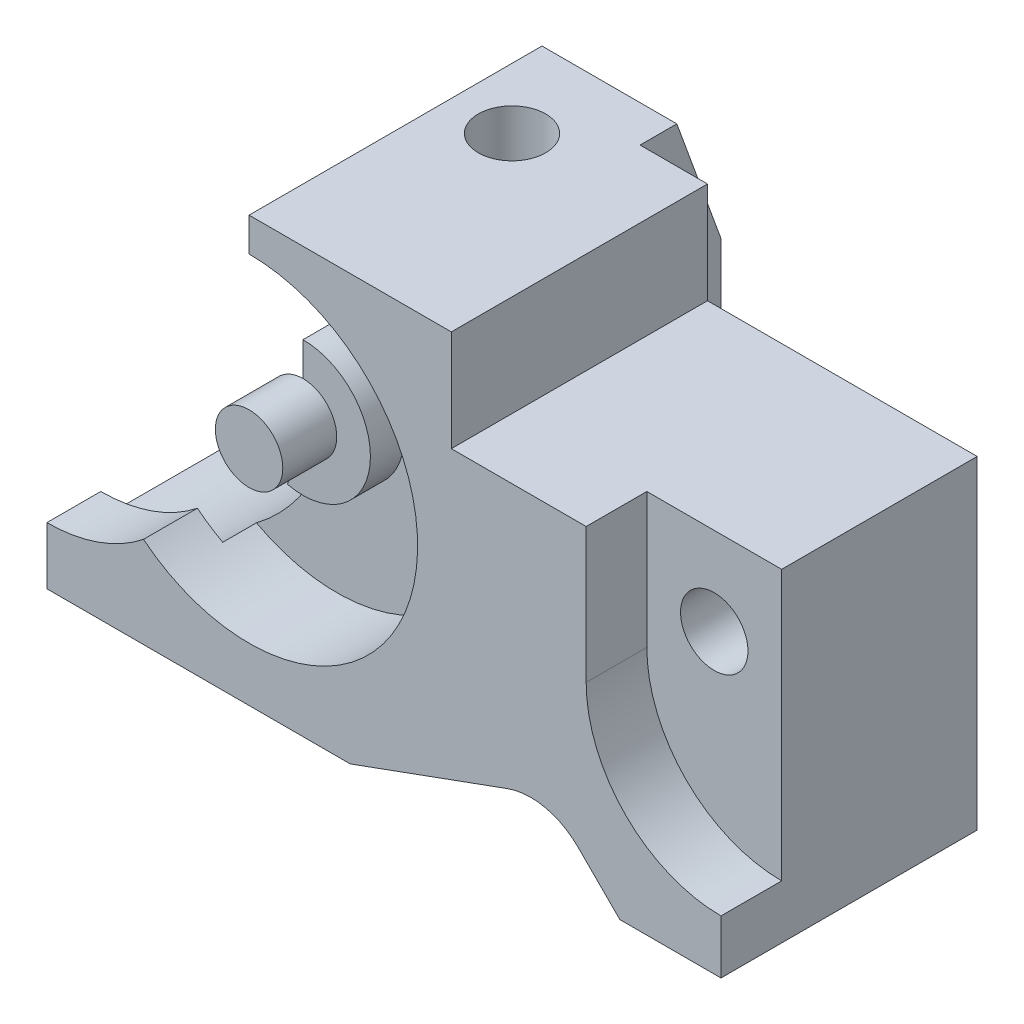
ISO-10303-21;
HEADER;
FILE_DESCRIPTION(('STEP AP214'),'2;1');
FILE_NAME('part.step','',(''),(''),'','','');
FILE_SCHEMA(('AUTOMOTIVE_DESIGN { 1 0 10303 214 1 1 1 1 }'));
ENDSEC;
DATA;
#1=APPLICATION_CONTEXT('core data for automotive mechanical design processes');
#2=APPLICATION_PROTOCOL_DEFINITION('international standard','automotive_design',2000,#1);
#3=PRODUCT_CONTEXT('',#1,'mechanical');
#4=PRODUCT('Part','Part','',(#3));
#5=PRODUCT_RELATED_PRODUCT_CATEGORY('part','',(#4));
#6=PRODUCT_DEFINITION_FORMATION('','',#4);
#7=PRODUCT_DEFINITION_CONTEXT('part definition',#1,'design');
#8=PRODUCT_DEFINITION('design','',#6,#7);
#9=PRODUCT_DEFINITION_SHAPE('','',#8);
#10=(LENGTH_UNIT() NAMED_UNIT(*) SI_UNIT(.MILLI.,.METRE.));
#11=(NAMED_UNIT(*) PLANE_ANGLE_UNIT() SI_UNIT($,.RADIAN.));
#12=(NAMED_UNIT(*) SI_UNIT($,.STERADIAN.) SOLID_ANGLE_UNIT());
#13=UNCERTAINTY_MEASURE_WITH_UNIT(LENGTH_MEASURE(1.E-05),#10,'distance_accuracy_value','');
#14=(GEOMETRIC_REPRESENTATION_CONTEXT(3) GLOBAL_UNCERTAINTY_ASSIGNED_CONTEXT((#13)) GLOBAL_UNIT_ASSIGNED_CONTEXT((#10,
#11,#12)) REPRESENTATION_CONTEXT('',''));
#15=CARTESIAN_POINT('',(0.,0.,0.));
#16=DIRECTION('',(0.,0.,1.));
#17=DIRECTION('',(1.,0.,0.));
#18=AXIS2_PLACEMENT_3D('',#15,#16,#17);
#19=CARTESIAN_POINT('',(0.,31.5,50.));
#20=DIRECTION('',(0.,-1.,0.));
#21=DIRECTION('',(1.,0.,0.));
#22=AXIS2_PLACEMENT_3D('',#19,#20,#21);
#23=PLANE('',#22);
#24=CARTESIAN_POINT('',(-11.,31.5,20.));
#25=DIRECTION('',(0.,1.,0.));
#26=DIRECTION('',(-1.,0.,0.));
#27=AXIS2_PLACEMENT_3D('',#24,#25,#26);
#28=CIRCLE('',#27,5.);
#29=CARTESIAN_POINT('',(-16.,31.5,20.));
#30=VERTEX_POINT('',#29);
#31=EDGE_CURVE('E848',#30,#30,#28,.T.);
#32=ORIENTED_EDGE('',*,*,#31,.F.);
#33=EDGE_LOOP('',(#32));
#34=FACE_BOUND('',#33,.T.);
#35=DIRECTION('',(0.,0.,-1.));
#36=VECTOR('',#35,1.);
#37=CARTESIAN_POINT('',(0.,31.5,12.));
#38=LINE('',#37,#36);
#39=CARTESIAN_POINT('',(0.,31.5,12.));
#40=VERTEX_POINT('',#39);
#41=CARTESIAN_POINT('',(0.,31.5,6.55146421679151));
#42=VERTEX_POINT('',#41);
#43=EDGE_CURVE('E218',#40,#42,#38,.T.);
#44=ORIENTED_EDGE('',*,*,#43,.T.);
#45=DIRECTION('',(-1.,0.,0.));
#46=VECTOR('',#45,1.);
#47=CARTESIAN_POINT('',(50.,31.5,6.55146421679152));
#48=LINE('',#47,#46);
#49=CARTESIAN_POINT('',(-20.,31.5,6.55146421679152));
#50=VERTEX_POINT('',#49);
#51=EDGE_CURVE('E251',#42,#50,#48,.T.);
#52=ORIENTED_EDGE('',*,*,#51,.T.);
#53=DIRECTION('',(0.,0.,1.));
#54=VECTOR('',#53,1.);
#55=CARTESIAN_POINT('',(-20.,31.5,-160.414502149899));
#56=LINE('',#55,#54);
#57=CARTESIAN_POINT('',(-20.,31.5,50.));
#58=VERTEX_POINT('',#57);
#59=EDGE_CURVE('E319',#50,#58,#56,.T.);
#60=ORIENTED_EDGE('',*,*,#59,.T.);
#61=DIRECTION('',(-1.,0.,0.));
#62=VECTOR('',#61,1.);
#63=CARTESIAN_POINT('',(0.,31.5,50.));
#64=LINE('',#63,#62);
#65=CARTESIAN_POINT('',(10.,31.5,50.));
#66=VERTEX_POINT('',#65);
#67=EDGE_CURVE('E370',#66,#58,#64,.T.);
#68=ORIENTED_EDGE('',*,*,#67,.F.);
#69=DIRECTION('',(0.,0.,-1.));
#70=VECTOR('',#69,1.);
#71=CARTESIAN_POINT('',(10.,31.5,50.));
#72=LINE('',#71,#70);
#73=CARTESIAN_POINT('',(10.,31.5,12.));
#74=VERTEX_POINT('',#73);
#75=EDGE_CURVE('E226',#66,#74,#72,.T.);
#76=ORIENTED_EDGE('',*,*,#75,.T.);
#77=DIRECTION('',(-1.,0.,0.));
#78=VECTOR('',#77,1.);
#79=CARTESIAN_POINT('',(50.,31.5,12.));
#80=LINE('',#79,#78);
#81=EDGE_CURVE('E210',#74,#40,#80,.T.);
#82=ORIENTED_EDGE('',*,*,#81,.T.);
#83=EDGE_LOOP('',(#44,#52,#60,#68,#76,#82));
#84=FACE_BOUND('',#83,.T.);
#85=ADVANCED_FACE('F39',(#34,#84),#23,.F.);
#86=CARTESIAN_POINT('',(0.,0.,0.));
#87=DIRECTION('',(0.,0.,1.));
#88=DIRECTION('',(1.,0.,0.));
#89=AXIS2_PLACEMENT_3D('',#86,#87,#88);
#90=PLANE('',#89);
#91=DIRECTION('',(0.,1.,0.));
#92=VECTOR('',#91,1.);
#93=CARTESIAN_POINT('',(0.,-31.5,0.));
#94=LINE('',#93,#92);
#95=CARTESIAN_POINT('',(0.,-29.680148828669,0.));
#96=VERTEX_POINT('',#95);
#97=CARTESIAN_POINT('',(0.,13.5,0.));
#98=VERTEX_POINT('',#97);
#99=EDGE_CURVE('E54',#96,#98,#94,.T.);
#100=ORIENTED_EDGE('',*,*,#99,.F.);
#101=DIRECTION('',(0.939692620785911,0.342020143325663,0.));
#102=VECTOR('',#101,1.);
#103=CARTESIAN_POINT('',(9.53901596036032,-26.2082309549077,0.));
#104=LINE('',#103,#102);
#105=CARTESIAN_POINT('',(-5.,-31.5,0.));
#106=VERTEX_POINT('',#105);
#107=EDGE_CURVE('E355',#106,#96,#104,.T.);
#108=ORIENTED_EDGE('',*,*,#107,.F.);
#109=DIRECTION('',(-1.,0.,0.));
#110=VECTOR('',#109,1.);
#111=CARTESIAN_POINT('',(0.,-31.5,0.));
#112=LINE('',#111,#110);
#113=CARTESIAN_POINT('',(-50.,-31.5,0.));
#114=VERTEX_POINT('',#113);
#115=EDGE_CURVE('E379',#106,#114,#112,.T.);
#116=ORIENTED_EDGE('',*,*,#115,.T.);
#117=DIRECTION('',(0.,1.,0.));
#118=VECTOR('',#117,1.);
#119=CARTESIAN_POINT('',(-50.,0.,0.));
#120=LINE('',#119,#118);
#121=CARTESIAN_POINT('',(-50.,-26.5,0.));
#122=VERTEX_POINT('',#121);
#123=EDGE_CURVE('E345',#114,#122,#120,.T.);
#124=ORIENTED_EDGE('',*,*,#123,.T.);
#125=CARTESIAN_POINT('',(-49.9332640536794,3.49992577179932,0.));
#126=DIRECTION('',(0.,0.,1.));
#127=DIRECTION('',(1.,0.,0.));
#128=AXIS2_PLACEMENT_3D('',#125,#126,#127);
#129=CIRCLE('',#128,30.);
#130=CARTESIAN_POINT('',(-20.,1.49999999999999,0.));
#131=VERTEX_POINT('',#130);
#132=EDGE_CURVE('E312',#131,#122,#129,.F.);
#133=ORIENTED_EDGE('',*,*,#132,.F.);
#134=DIRECTION('',(0.,-1.,0.));
#135=VECTOR('',#134,1.);
#136=CARTESIAN_POINT('',(-20.,1.5,0.));
#137=LINE('',#136,#135);
#138=CARTESIAN_POINT('',(-20.,13.5000000000001,0.));
#139=VERTEX_POINT('',#138);
#140=EDGE_CURVE('E313',#139,#131,#137,.T.);
#141=ORIENTED_EDGE('',*,*,#140,.F.);
#142=DIRECTION('',(-1.,0.,0.));
#143=VECTOR('',#142,1.);
#144=CARTESIAN_POINT('',(50.,13.5,0.));
#145=LINE('',#144,#143);
#146=EDGE_CURVE('E61',#98,#139,#145,.T.);
#147=ORIENTED_EDGE('',*,*,#146,.F.);
#148=EDGE_LOOP('',(#100,#108,#116,#124,#133,#141,#147));
#149=FACE_BOUND('',#148,.T.);
#150=ADVANCED_FACE('F439',(#149),#90,.F.);
#151=CARTESIAN_POINT('',(40.,3.50000000000002,0.));
#152=DIRECTION('',(0.,0.,1.));
#153=DIRECTION('',(1.,0.,0.));
#154=AXIS2_PLACEMENT_3D('',#151,#152,#153);
#155=CYLINDRICAL_SURFACE('',#154,5.);
#156=CARTESIAN_POINT('',(40.,3.50000000000002,41.));
#157=DIRECTION('',(0.,0.,1.));
#158=DIRECTION('',(1.,0.,0.));
#159=AXIS2_PLACEMENT_3D('',#156,#157,#158);
#160=CIRCLE('',#159,5.);
#161=CARTESIAN_POINT('',(45.,3.50000000000002,41.));
#162=VERTEX_POINT('',#161);
#163=EDGE_CURVE('E325',#162,#162,#160,.T.);
#164=ORIENTED_EDGE('',*,*,#163,.T.);
#165=EDGE_LOOP('',(#164));
#166=FACE_BOUND('',#165,.T.);
#167=CARTESIAN_POINT('',(40.,3.50000000000002,12.));
#168=DIRECTION('',(0.,0.,-1.));
#169=DIRECTION('',(-1.,0.,0.));
#170=AXIS2_PLACEMENT_3D('',#167,#168,#169);
#171=CIRCLE('',#170,5.);
#172=CARTESIAN_POINT('',(35.,3.50000000000002,12.));
#173=VERTEX_POINT('',#172);
#174=EDGE_CURVE('E246',#173,#173,#171,.F.);
#175=ORIENTED_EDGE('',*,*,#174,.F.);
#176=EDGE_LOOP('',(#175));
#177=FACE_BOUND('',#176,.T.);
#178=ADVANCED_FACE('F474',(#166,#177),#155,.F.);
#179=CARTESIAN_POINT('',(21.7598523663272,-32.4019879900582,50.));
#180=DIRECTION('',(0.,0.,-1.));
#181=DIRECTION('',(-1.,0.,0.));
#182=AXIS2_PLACEMENT_3D('',#179,#180,#181);
#183=CYLINDRICAL_SURFACE('',#182,10.);
#184=DIRECTION('',(0.,0.,-1.));
#185=VECTOR('',#184,1.);
#186=CARTESIAN_POINT('',(18.3396509330706,-23.0050617821991,50.));
#187=LINE('',#186,#185);
#188=CARTESIAN_POINT('',(18.3396509330706,-23.0050617821991,50.));
#189=VERTEX_POINT('',#188);
#190=CARTESIAN_POINT('',(18.3396509330706,-23.0050617821991,12.));
#191=VERTEX_POINT('',#190);
#192=EDGE_CURVE('E378',#189,#191,#187,.T.);
#193=ORIENTED_EDGE('',*,*,#192,.T.);
#194=CARTESIAN_POINT('',(21.7598523663272,-32.4019879900582,12.));
#195=DIRECTION('',(0.,0.,-1.));
#196=DIRECTION('',(-1.,0.,0.));
#197=AXIS2_PLACEMENT_3D('',#194,#195,#196);
#198=CIRCLE('',#197,10.);
#199=CARTESIAN_POINT('',(28.8309201781926,-25.3309201781927,12.));
#200=VERTEX_POINT('',#199);
#201=EDGE_CURVE('E236',#191,#200,#198,.T.);
#202=ORIENTED_EDGE('',*,*,#201,.T.);
#203=DIRECTION('',(0.,0.,-1.));
#204=VECTOR('',#203,1.);
#205=CARTESIAN_POINT('',(28.8309201781926,-25.3309201781927,50.));
#206=LINE('',#205,#204);
#207=CARTESIAN_POINT('',(28.8309201781926,-25.3309201781927,50.));
#208=VERTEX_POINT('',#207);
#209=EDGE_CURVE('E404',#208,#200,#206,.T.);
#210=ORIENTED_EDGE('',*,*,#209,.F.);
#211=CARTESIAN_POINT('',(21.7598523663272,-32.4019879900582,50.));
#212=DIRECTION('',(0.,0.,1.));
#213=DIRECTION('',(1.,0.,0.));
#214=AXIS2_PLACEMENT_3D('',#211,#212,#213);
#215=CIRCLE('',#214,10.);
#216=EDGE_CURVE('E351',#208,#189,#215,.T.);
#217=ORIENTED_EDGE('',*,*,#216,.T.);
#218=EDGE_LOOP('',(#193,#202,#210,#217));
#219=FACE_BOUND('',#218,.T.);
#220=ADVANCED_FACE('F41',(#219),#183,.F.);
#221=CARTESIAN_POINT('',(1.74999999999982,1.74999999999984,50.));
#222=DIRECTION('',(0.707106781186544,0.707106781186551,0.));
#223=DIRECTION('',(-0.707106781186551,0.707106781186544,0.));
#224=AXIS2_PLACEMENT_3D('',#221,#222,#223);
#225=PLANE('',#224);
#226=DIRECTION('',(-0.707106781186551,0.707106781186544,0.));
#227=VECTOR('',#226,1.);
#228=CARTESIAN_POINT('',(1.74999999999982,1.74999999999984,12.));
#229=LINE('',#228,#227);
#230=CARTESIAN_POINT('',(35.,-31.5,12.));
#231=VERTEX_POINT('',#230);
#232=EDGE_CURVE('E239',#231,#200,#229,.T.);
#233=ORIENTED_EDGE('',*,*,#232,.F.);
#234=DIRECTION('',(0.,0.,-1.));
#235=VECTOR('',#234,1.);
#236=CARTESIAN_POINT('',(35.,-31.5,50.));
#237=LINE('',#236,#235);
#238=CARTESIAN_POINT('',(35.,-31.5,50.));
#239=VERTEX_POINT('',#238);
#240=EDGE_CURVE('E401',#239,#231,#237,.T.);
#241=ORIENTED_EDGE('',*,*,#240,.F.);
#242=DIRECTION('',(0.707106781186551,-0.707106781186544,0.));
#243=VECTOR('',#242,1.);
#244=CARTESIAN_POINT('',(1.74999999999982,1.74999999999984,50.));
#245=LINE('',#244,#243);
#246=EDGE_CURVE('E354',#208,#239,#245,.T.);
#247=ORIENTED_EDGE('',*,*,#246,.F.);
#248=ORIENTED_EDGE('',*,*,#209,.T.);
#249=EDGE_LOOP('',(#233,#241,#247,#248));
#250=FACE_BOUND('',#249,.T.);
#251=ADVANCED_FACE('F492',(#250),#225,.F.);
#252=CARTESIAN_POINT('',(0.,-31.5,50.));
#253=DIRECTION('',(0.,-1.,0.));
#254=DIRECTION('',(1.,0.,0.));
#255=AXIS2_PLACEMENT_3D('',#252,#253,#254);
#256=PLANE('',#255);
#257=ORIENTED_EDGE('',*,*,#240,.T.);
#258=DIRECTION('',(-1.,0.,0.));
#259=VECTOR('',#258,1.);
#260=CARTESIAN_POINT('',(50.,-31.5,12.));
#261=LINE('',#260,#259);
#262=CARTESIAN_POINT('',(50.,-31.5,12.));
#263=VERTEX_POINT('',#262);
#264=EDGE_CURVE('E215',#263,#231,#261,.T.);
#265=ORIENTED_EDGE('',*,*,#264,.F.);
#266=DIRECTION('',(0.,0.,-1.));
#267=VECTOR('',#266,1.);
#268=CARTESIAN_POINT('',(50.,-31.5,50.));
#269=LINE('',#268,#267);
#270=CARTESIAN_POINT('',(50.,-31.5,50.));
#271=VERTEX_POINT('',#270);
#272=EDGE_CURVE('E398',#271,#263,#269,.T.);
#273=ORIENTED_EDGE('',*,*,#272,.F.);
#274=DIRECTION('',(-1.,0.,0.));
#275=VECTOR('',#274,1.);
#276=CARTESIAN_POINT('',(0.,-31.5,50.));
#277=LINE('',#276,#275);
#278=EDGE_CURVE('E357',#271,#239,#277,.T.);
#279=ORIENTED_EDGE('',*,*,#278,.T.);
#280=EDGE_LOOP('',(#257,#265,#273,#279));
#281=FACE_BOUND('',#280,.T.);
#282=ADVANCED_FACE('F490',(#281),#256,.T.);
#283=CARTESIAN_POINT('',(50.,0.,50.));
#284=DIRECTION('',(-1.,0.,0.));
#285=DIRECTION('',(0.,-1.,0.));
#286=AXIS2_PLACEMENT_3D('',#283,#284,#285);
#287=PLANE('',#286);
#288=DIRECTION('',(0.,1.,0.));
#289=VECTOR('',#288,1.);
#290=CARTESIAN_POINT('',(50.,-31.5,12.));
#291=LINE('',#290,#289);
#292=CARTESIAN_POINT('',(50.,16.5,12.));
#293=VERTEX_POINT('',#292);
#294=EDGE_CURVE('E214',#263,#293,#291,.T.);
#295=ORIENTED_EDGE('',*,*,#294,.T.);
#296=DIRECTION('',(0.,0.,-1.));
#297=VECTOR('',#296,1.);
#298=CARTESIAN_POINT('',(50.,16.5,50.));
#299=LINE('',#298,#297);
#300=CARTESIAN_POINT('',(50.,16.5,41.));
#301=VERTEX_POINT('',#300);
#302=EDGE_CURVE('E395',#301,#293,#299,.T.);
#303=ORIENTED_EDGE('',*,*,#302,.F.);
#304=DIRECTION('',(0.,1.,0.));
#305=VECTOR('',#304,1.);
#306=CARTESIAN_POINT('',(50.,0.,41.));
#307=LINE('',#306,#305);
#308=CARTESIAN_POINT('',(50.,-23.523038750998,41.));
#309=VERTEX_POINT('',#308);
#310=EDGE_CURVE('E335',#309,#301,#307,.T.);
#311=ORIENTED_EDGE('',*,*,#310,.F.);
#312=DIRECTION('',(0.,0.,1.));
#313=VECTOR('',#312,1.);
#314=CARTESIAN_POINT('',(50.,-23.523038750998,41.));
#315=LINE('',#314,#313);
#316=CARTESIAN_POINT('',(50.,-23.523038750998,50.));
#317=VERTEX_POINT('',#316);
#318=EDGE_CURVE('E346',#309,#317,#315,.T.);
#319=ORIENTED_EDGE('',*,*,#318,.T.);
#320=DIRECTION('',(0.,1.,0.));
#321=VECTOR('',#320,1.);
#322=CARTESIAN_POINT('',(50.,0.,50.));
#323=LINE('',#322,#321);
#324=EDGE_CURVE('E360',#271,#317,#323,.T.);
#325=ORIENTED_EDGE('',*,*,#324,.F.);
#326=ORIENTED_EDGE('',*,*,#272,.T.);
#327=EDGE_LOOP('',(#295,#303,#311,#319,#325,#326));
#328=FACE_BOUND('',#327,.T.);
#329=ADVANCED_FACE('F487',(#328),#287,.F.);
#330=CARTESIAN_POINT('',(0.,16.5,50.));
#331=DIRECTION('',(0.,1.,0.));
#332=DIRECTION('',(0.,0.,1.));
#333=AXIS2_PLACEMENT_3D('',#330,#331,#332);
#334=PLANE('',#333);
#335=ORIENTED_EDGE('',*,*,#302,.T.);
#336=DIRECTION('',(-1.,0.,0.));
#337=VECTOR('',#336,1.);
#338=CARTESIAN_POINT('',(0.,16.5,12.));
#339=LINE('',#338,#337);
#340=CARTESIAN_POINT('',(10.,16.5,12.));
#341=VERTEX_POINT('',#340);
#342=EDGE_CURVE('E243',#293,#341,#339,.T.);
#343=ORIENTED_EDGE('',*,*,#342,.T.);
#344=DIRECTION('',(0.,0.,-1.));
#345=VECTOR('',#344,1.);
#346=CARTESIAN_POINT('',(10.,16.5,50.));
#347=LINE('',#346,#345);
#348=CARTESIAN_POINT('',(10.,16.5,50.));
#349=VERTEX_POINT('',#348);
#350=EDGE_CURVE('E392',#349,#341,#347,.T.);
#351=ORIENTED_EDGE('',*,*,#350,.F.);
#352=DIRECTION('',(1.,0.,0.));
#353=VECTOR('',#352,1.);
#354=CARTESIAN_POINT('',(0.,16.5,50.));
#355=LINE('',#354,#353);
#356=CARTESIAN_POINT('',(30.,16.5,50.));
#357=VERTEX_POINT('',#356);
#358=EDGE_CURVE('E364',#349,#357,#355,.T.);
#359=ORIENTED_EDGE('',*,*,#358,.T.);
#360=DIRECTION('',(0.,0.,1.));
#361=VECTOR('',#360,1.);
#362=CARTESIAN_POINT('',(30.,16.5,41.));
#363=LINE('',#362,#361);
#364=CARTESIAN_POINT('',(30.,16.5,41.));
#365=VERTEX_POINT('',#364);
#366=EDGE_CURVE('E343',#365,#357,#363,.T.);
#367=ORIENTED_EDGE('',*,*,#366,.F.);
#368=DIRECTION('',(-1.,0.,0.));
#369=VECTOR('',#368,1.);
#370=CARTESIAN_POINT('',(0.,16.5,41.));
#371=LINE('',#370,#369);
#372=EDGE_CURVE('E337',#301,#365,#371,.T.);
#373=ORIENTED_EDGE('',*,*,#372,.F.);
#374=EDGE_LOOP('',(#335,#343,#351,#359,#367,#373));
#375=FACE_BOUND('',#374,.T.);
#376=ADVANCED_FACE('F483',(#375),#334,.T.);
#377=CARTESIAN_POINT('',(10.,0.,50.));
#378=DIRECTION('',(1.,0.,0.));
#379=DIRECTION('',(0.,1.,0.));
#380=AXIS2_PLACEMENT_3D('',#377,#378,#379);
#381=PLANE('',#380);
#382=ORIENTED_EDGE('',*,*,#350,.T.);
#383=DIRECTION('',(0.,1.,0.));
#384=VECTOR('',#383,1.);
#385=CARTESIAN_POINT('',(10.,0.,12.));
#386=LINE('',#385,#384);
#387=EDGE_CURVE('E241',#341,#74,#386,.T.);
#388=ORIENTED_EDGE('',*,*,#387,.T.);
#389=ORIENTED_EDGE('',*,*,#75,.F.);
#390=DIRECTION('',(0.,-1.,0.));
#391=VECTOR('',#390,1.);
#392=CARTESIAN_POINT('',(10.,0.,50.));
#393=LINE('',#392,#391);
#394=EDGE_CURVE('E367',#66,#349,#393,.T.);
#395=ORIENTED_EDGE('',*,*,#394,.T.);
#396=EDGE_LOOP('',(#382,#388,#389,#395));
#397=FACE_BOUND('',#396,.T.);
#398=ADVANCED_FACE('F480',(#397),#381,.T.);
#399=CARTESIAN_POINT('',(9.53901596036032,-26.2082309549077,50.));
#400=DIRECTION('',(-0.342020143325663,0.93969262078591,0.));
#401=DIRECTION('',(-0.939692620785911,-0.342020143325663,0.));
#402=AXIS2_PLACEMENT_3D('',#399,#400,#401);
#403=PLANE('',#402);
#404=DIRECTION('',(0.,0.,-1.));
#405=VECTOR('',#404,1.);
#406=CARTESIAN_POINT('',(0.,-29.680148828669,50.));
#407=LINE('',#406,#405);
#408=CARTESIAN_POINT('',(0.,-29.680148828669,12.));
#409=VERTEX_POINT('',#408);
#410=EDGE_CURVE('E234',#409,#96,#407,.T.);
#411=ORIENTED_EDGE('',*,*,#410,.F.);
#412=DIRECTION('',(-0.939692620785911,-0.342020143325663,0.));
#413=VECTOR('',#412,1.);
#414=CARTESIAN_POINT('',(9.53901596036032,-26.2082309549077,12.));
#415=LINE('',#414,#413);
#416=EDGE_CURVE('E11',#191,#409,#415,.T.);
#417=ORIENTED_EDGE('',*,*,#416,.F.);
#418=ORIENTED_EDGE('',*,*,#192,.F.);
#419=DIRECTION('',(0.939692620785911,0.342020143325663,0.));
#420=VECTOR('',#419,1.);
#421=CARTESIAN_POINT('',(9.53901596036032,-26.2082309549077,50.));
#422=LINE('',#421,#420);
#423=CARTESIAN_POINT('',(-5.,-31.5,50.));
#424=VERTEX_POINT('',#423);
#425=EDGE_CURVE('E376',#424,#189,#422,.T.);
#426=ORIENTED_EDGE('',*,*,#425,.F.);
#427=DIRECTION('',(0.,0.,-1.));
#428=VECTOR('',#427,1.);
#429=CARTESIAN_POINT('',(-5.,-31.5,50.));
#430=LINE('',#429,#428);
#431=EDGE_CURVE('E387',#424,#106,#430,.T.);
#432=ORIENTED_EDGE('',*,*,#431,.T.);
#433=ORIENTED_EDGE('',*,*,#107,.T.);
#434=EDGE_LOOP('',(#411,#417,#418,#426,#432,#433));
#435=FACE_BOUND('',#434,.T.);
#436=ADVANCED_FACE('F464',(#435),#403,.F.);
#437=CARTESIAN_POINT('',(50.,13.5,0.));
#438=DIRECTION('',(0.,-0.342020143325663,0.939692620785911));
#439=DIRECTION('',(0.,-0.939692620785911,-0.342020143325663));
#440=AXIS2_PLACEMENT_3D('',#437,#438,#439);
#441=PLANE('',#440);
#442=DIRECTION('',(0.,0.939692620785911,0.342020143325663));
#443=VECTOR('',#442,1.);
#444=CARTESIAN_POINT('',(0.,13.5,0.));
#445=LINE('',#444,#443);
#446=EDGE_CURVE('E47',#98,#42,#445,.T.);
#447=ORIENTED_EDGE('',*,*,#446,.F.);
#448=ORIENTED_EDGE('',*,*,#146,.T.);
#449=DIRECTION('',(0.,0.939692620785911,0.342020143325663));
#450=VECTOR('',#449,1.);
#451=CARTESIAN_POINT('',(-20.,13.5,0.));
#452=LINE('',#451,#450);
#453=EDGE_CURVE('E249',#139,#50,#452,.T.);
#454=ORIENTED_EDGE('',*,*,#453,.T.);
#455=ORIENTED_EDGE('',*,*,#51,.F.);
#456=EDGE_LOOP('',(#447,#448,#454,#455));
#457=FACE_BOUND('',#456,.T.);
#458=ADVANCED_FACE('F456',(#457),#441,.F.);
#459=CARTESIAN_POINT('',(-20.,1.5,37.));
#460=DIRECTION('',(0.,0.,1.));
#461=DIRECTION('',(1.,0.,0.));
#462=AXIS2_PLACEMENT_3D('',#459,#460,#461);
#463=PLANE('',#462);
#464=DIRECTION('',(0.,-1.,0.));
#465=VECTOR('',#464,1.);
#466=CARTESIAN_POINT('',(-20.,1.5,37.));
#467=LINE('',#466,#465);
#468=CARTESIAN_POINT('',(-20.,26.5,37.));
#469=VERTEX_POINT('',#468);
#470=CARTESIAN_POINT('',(-20.,11.5,37.));
#471=VERTEX_POINT('',#470);
#472=EDGE_CURVE('E288',#469,#471,#467,.T.);
#473=ORIENTED_EDGE('',*,*,#472,.T.);
#474=CARTESIAN_POINT('',(-20.,1.5,37.));
#475=DIRECTION('',(0.,0.,1.));
#476=DIRECTION('',(-1.,0.,0.));
#477=AXIS2_PLACEMENT_3D('',#474,#475,#476);
#478=CIRCLE('',#477,10.);
#479=CARTESIAN_POINT('',(-22.3202769155512,-8.22709180768643,37.));
#480=VERTEX_POINT('',#479);
#481=EDGE_CURVE('E258',#480,#471,#478,.T.);
#482=ORIENTED_EDGE('',*,*,#481,.F.);
#483=CARTESIAN_POINT('',(-49.9332640536794,3.49992577179932,37.));
#484=DIRECTION('',(0.,0.,1.));
#485=DIRECTION('',(1.,0.,0.));
#486=AXIS2_PLACEMENT_3D('',#483,#484,#485);
#487=CIRCLE('',#486,30.);
#488=CARTESIAN_POINT('',(-31.9085371363609,-20.4815091218031,37.));
#489=VERTEX_POINT('',#488);
#490=EDGE_CURVE('E297',#480,#489,#487,.F.);
#491=ORIENTED_EDGE('',*,*,#490,.T.);
#492=CARTESIAN_POINT('',(-20.,1.5,37.));
#493=DIRECTION('',(0.,0.,1.));
#494=DIRECTION('',(1.,0.,0.));
#495=AXIS2_PLACEMENT_3D('',#492,#493,#494);
#496=CIRCLE('',#495,25.);
#497=EDGE_CURVE('E279',#489,#469,#496,.T.);
#498=ORIENTED_EDGE('',*,*,#497,.T.);
#499=EDGE_LOOP('',(#473,#482,#491,#498));
#500=FACE_BOUND('',#499,.T.);
#501=ADVANCED_FACE('F454',(#500),#463,.T.);
#502=CARTESIAN_POINT('',(-20.,1.5,7.99999999999998));
#503=DIRECTION('',(0.,0.,1.));
#504=DIRECTION('',(1.,0.,0.));
#505=AXIS2_PLACEMENT_3D('',#502,#503,#504);
#506=CYLINDRICAL_SURFACE('',#505,25.);
#507=DIRECTION('',(0.,0.,-1.));
#508=VECTOR('',#507,1.);
#509=CARTESIAN_POINT('',(-35.663253509772,-17.9849298045596,210.414502149899));
#510=LINE('',#509,#508);
#511=CARTESIAN_POINT('',(-35.663253509772,-17.9849298045596,50.));
#512=VERTEX_POINT('',#511);
#513=CARTESIAN_POINT('',(-35.663253509772,-17.9849298045596,42.));
#514=VERTEX_POINT('',#513);
#515=EDGE_CURVE('E290',#512,#514,#510,.T.);
#516=ORIENTED_EDGE('',*,*,#515,.F.);
#517=CARTESIAN_POINT('',(-20.,1.5,50.));
#518=DIRECTION('',(0.,0.,1.));
#519=DIRECTION('',(1.,0.,0.));
#520=AXIS2_PLACEMENT_3D('',#517,#518,#519);
#521=CIRCLE('',#520,25.);
#522=CARTESIAN_POINT('',(-20.,26.5,50.));
#523=VERTEX_POINT('',#522);
#524=EDGE_CURVE('E306',#512,#523,#521,.T.);
#525=ORIENTED_EDGE('',*,*,#524,.T.);
#526=DIRECTION('',(0.,0.,1.));
#527=VECTOR('',#526,1.);
#528=CARTESIAN_POINT('',(-20.,26.5,37.));
#529=LINE('',#528,#527);
#530=EDGE_CURVE('E285',#469,#523,#529,.T.);
#531=ORIENTED_EDGE('',*,*,#530,.F.);
#532=ORIENTED_EDGE('',*,*,#497,.F.);
#533=DIRECTION('',(0.,0.,1.));
#534=VECTOR('',#533,1.);
#535=CARTESIAN_POINT('',(-31.9085371363609,-20.4815091218031,43.5));
#536=LINE('',#535,#534);
#537=CARTESIAN_POINT('',(-31.9085371363609,-20.4815091218031,42.));
#538=VERTEX_POINT('',#537);
#539=EDGE_CURVE('E282',#538,#489,#536,.F.);
#540=ORIENTED_EDGE('',*,*,#539,.F.);
#541=CARTESIAN_POINT('',(-20.,1.5,42.));
#542=DIRECTION('',(0.,0.,1.));
#543=DIRECTION('',(1.,0.,0.));
#544=AXIS2_PLACEMENT_3D('',#541,#542,#543);
#545=CIRCLE('',#544,25.);
#546=EDGE_CURVE('E298',#514,#538,#545,.T.);
#547=ORIENTED_EDGE('',*,*,#546,.F.);
#548=EDGE_LOOP('',(#516,#525,#531,#532,#540,#547));
#549=FACE_BOUND('',#548,.T.);
#550=ADVANCED_FACE('F452',(#549),#506,.F.);
#551=CARTESIAN_POINT('',(0.,0.,50.));
#552=DIRECTION('',(0.,0.,1.));
#553=DIRECTION('',(1.,0.,0.));
#554=AXIS2_PLACEMENT_3D('',#551,#552,#553);
#555=PLANE('',#554);
#556=DIRECTION('',(0.,-1.,0.));
#557=VECTOR('',#556,1.);
#558=CARTESIAN_POINT('',(-20.,0.,50.));
#559=LINE('',#558,#557);
#560=EDGE_CURVE('E303',#58,#523,#559,.T.);
#561=ORIENTED_EDGE('',*,*,#560,.T.);
#562=ORIENTED_EDGE('',*,*,#524,.F.);
#563=CARTESIAN_POINT('',(-50.,0.,50.));
#564=DIRECTION('',(0.,0.,1.));
#565=DIRECTION('',(1.,0.,0.));
#566=AXIS2_PLACEMENT_3D('',#563,#564,#565);
#567=CIRCLE('',#566,23.);
#568=CARTESIAN_POINT('',(-50.,-23.,50.));
#569=VERTEX_POINT('',#568);
#570=EDGE_CURVE('E301',#512,#569,#567,.F.);
#571=ORIENTED_EDGE('',*,*,#570,.T.);
#572=DIRECTION('',(0.,1.,0.));
#573=VECTOR('',#572,1.);
#574=CARTESIAN_POINT('',(-50.,0.,50.));
#575=LINE('',#574,#573);
#576=CARTESIAN_POINT('',(-50.,-31.5,50.));
#577=VERTEX_POINT('',#576);
#578=EDGE_CURVE('E373',#577,#569,#575,.T.);
#579=ORIENTED_EDGE('',*,*,#578,.F.);
#580=EDGE_CURVE('E361',#424,#577,#277,.T.);
#581=ORIENTED_EDGE('',*,*,#580,.F.);
#582=ORIENTED_EDGE('',*,*,#425,.T.);
#583=ORIENTED_EDGE('',*,*,#216,.F.);
#584=ORIENTED_EDGE('',*,*,#246,.T.);
#585=ORIENTED_EDGE('',*,*,#278,.F.);
#586=ORIENTED_EDGE('',*,*,#324,.T.);
#587=CARTESIAN_POINT('',(50.,-3.52303875099799,50.));
#588=DIRECTION('',(0.,0.,1.));
#589=DIRECTION('',(1.,0.,0.));
#590=AXIS2_PLACEMENT_3D('',#587,#588,#589);
#591=CIRCLE('',#590,20.);
#592=CARTESIAN_POINT('',(30.,-3.52303875099799,50.));
#593=VERTEX_POINT('',#592);
#594=EDGE_CURVE('E329',#593,#317,#591,.T.);
#595=ORIENTED_EDGE('',*,*,#594,.F.);
#596=DIRECTION('',(0.,-1.,0.));
#597=VECTOR('',#596,1.);
#598=CARTESIAN_POINT('',(30.,0.,50.));
#599=LINE('',#598,#597);
#600=EDGE_CURVE('E323',#357,#593,#599,.T.);
#601=ORIENTED_EDGE('',*,*,#600,.F.);
#602=ORIENTED_EDGE('',*,*,#358,.F.);
#603=ORIENTED_EDGE('',*,*,#394,.F.);
#604=ORIENTED_EDGE('',*,*,#67,.T.);
#605=EDGE_LOOP('',(#561,#562,#571,#579,#581,#582,#583,#584,#585,#586,#595,#601,#602,#603,#604));
#606=FACE_BOUND('',#605,.T.);
#607=ADVANCED_FACE('F462',(#606),#555,.T.);
#608=CARTESIAN_POINT('',(-50.,0.,50.));
#609=DIRECTION('',(-1.,0.,0.));
#610=DIRECTION('',(0.,0.,1.));
#611=AXIS2_PLACEMENT_3D('',#608,#609,#610);
#612=PLANE('',#611);
#613=ORIENTED_EDGE('',*,*,#578,.T.);
#614=DIRECTION('',(0.,0.,-1.));
#615=VECTOR('',#614,1.);
#616=CARTESIAN_POINT('',(-50.,-23.,210.414502149899));
#617=LINE('',#616,#615);
#618=CARTESIAN_POINT('',(-50.,-23.,42.));
#619=VERTEX_POINT('',#618);
#620=EDGE_CURVE('E294',#569,#619,#617,.T.);
#621=ORIENTED_EDGE('',*,*,#620,.T.);
#622=DIRECTION('',(0.,1.,0.));
#623=VECTOR('',#622,1.);
#624=CARTESIAN_POINT('',(-50.,0.,42.));
#625=LINE('',#624,#623);
#626=CARTESIAN_POINT('',(-50.,-26.5,42.));
#627=VERTEX_POINT('',#626);
#628=EDGE_CURVE('E308',#627,#619,#625,.T.);
#629=ORIENTED_EDGE('',*,*,#628,.F.);
#630=DIRECTION('',(0.,0.,1.));
#631=VECTOR('',#630,1.);
#632=CARTESIAN_POINT('',(-50.,-26.5,-160.414502149899));
#633=LINE('',#632,#631);
#634=EDGE_CURVE('E311',#122,#627,#633,.T.);
#635=ORIENTED_EDGE('',*,*,#634,.F.);
#636=ORIENTED_EDGE('',*,*,#123,.F.);
#637=DIRECTION('',(0.,0.,-1.));
#638=VECTOR('',#637,1.);
#639=CARTESIAN_POINT('',(-50.,-31.5,50.));
#640=LINE('',#639,#638);
#641=EDGE_CURVE('E389',#577,#114,#640,.T.);
#642=ORIENTED_EDGE('',*,*,#641,.F.);
#643=EDGE_LOOP('',(#613,#621,#629,#635,#636,#642));
#644=FACE_BOUND('',#643,.T.);
#645=ADVANCED_FACE('F444',(#644),#612,.T.);
#646=CARTESIAN_POINT('',(0.,0.,42.));
#647=DIRECTION('',(0.,0.,1.));
#648=DIRECTION('',(1.,0.,0.));
#649=AXIS2_PLACEMENT_3D('',#646,#647,#648);
#650=PLANE('',#649);
#651=ORIENTED_EDGE('',*,*,#546,.T.);
#652=CARTESIAN_POINT('',(-49.9332640536794,3.49992577179932,42.));
#653=DIRECTION('',(0.,0.,1.));
#654=DIRECTION('',(1.,0.,0.));
#655=AXIS2_PLACEMENT_3D('',#652,#653,#654);
#656=CIRCLE('',#655,30.);
#657=EDGE_CURVE('E309',#538,#627,#656,.F.);
#658=ORIENTED_EDGE('',*,*,#657,.T.);
#659=ORIENTED_EDGE('',*,*,#628,.T.);
#660=CARTESIAN_POINT('',(-50.,0.,42.));
#661=DIRECTION('',(0.,0.,1.));
#662=DIRECTION('',(1.,0.,0.));
#663=AXIS2_PLACEMENT_3D('',#660,#661,#662);
#664=CIRCLE('',#663,23.);
#665=EDGE_CURVE('E293',#514,#619,#664,.F.);
#666=ORIENTED_EDGE('',*,*,#665,.F.);
#667=EDGE_LOOP('',(#651,#658,#659,#666));
#668=FACE_BOUND('',#667,.T.);
#669=ADVANCED_FACE('F447',(#668),#650,.F.);
#670=CARTESIAN_POINT('',(-11.,-31.5,20.));
#671=DIRECTION('',(0.,1.,0.));
#672=DIRECTION('',(-1.,0.,0.));
#673=AXIS2_PLACEMENT_3D('',#670,#671,#672);
#674=CIRCLE('',#673,5.);
#675=CARTESIAN_POINT('',(-16.,-31.5,20.));
#676=VERTEX_POINT('',#675);
#677=EDGE_CURVE('E222',#676,#676,#674,.T.);
#678=ORIENTED_EDGE('',*,*,#677,.T.);
#679=EDGE_LOOP('',(#678));
#680=FACE_BOUND('',#679,.T.);
#681=ORIENTED_EDGE('',*,*,#115,.F.);
#682=ORIENTED_EDGE('',*,*,#431,.F.);
#683=ORIENTED_EDGE('',*,*,#580,.T.);
#684=ORIENTED_EDGE('',*,*,#641,.T.);
#685=EDGE_LOOP('',(#681,#682,#683,#684));
#686=FACE_BOUND('',#685,.T.);
#687=ADVANCED_FACE('F500',(#680,#686),#256,.T.);
#688=CARTESIAN_POINT('',(30.,0.,41.));
#689=DIRECTION('',(-1.,0.,0.));
#690=DIRECTION('',(0.,0.,1.));
#691=AXIS2_PLACEMENT_3D('',#688,#689,#690);
#692=PLANE('',#691);
#693=ORIENTED_EDGE('',*,*,#600,.T.);
#694=DIRECTION('',(0.,0.,1.));
#695=VECTOR('',#694,1.);
#696=CARTESIAN_POINT('',(30.,-3.52303875099799,41.));
#697=LINE('',#696,#695);
#698=CARTESIAN_POINT('',(30.,-3.52303875099799,41.));
#699=VERTEX_POINT('',#698);
#700=EDGE_CURVE('E340',#699,#593,#697,.T.);
#701=ORIENTED_EDGE('',*,*,#700,.F.);
#702=DIRECTION('',(0.,-1.,0.));
#703=VECTOR('',#702,1.);
#704=CARTESIAN_POINT('',(30.,0.,41.));
#705=LINE('',#704,#703);
#706=EDGE_CURVE('E328',#365,#699,#705,.T.);
#707=ORIENTED_EDGE('',*,*,#706,.F.);
#708=ORIENTED_EDGE('',*,*,#366,.T.);
#709=EDGE_LOOP('',(#693,#701,#707,#708));
#710=FACE_BOUND('',#709,.T.);
#711=ADVANCED_FACE('F538',(#710),#692,.F.);
#712=CARTESIAN_POINT('',(50.,-3.52303875099799,41.));
#713=DIRECTION('',(0.,0.,1.));
#714=DIRECTION('',(1.,0.,0.));
#715=AXIS2_PLACEMENT_3D('',#712,#713,#714);
#716=CYLINDRICAL_SURFACE('',#715,20.);
#717=ORIENTED_EDGE('',*,*,#594,.T.);
#718=ORIENTED_EDGE('',*,*,#318,.F.);
#719=CARTESIAN_POINT('',(50.,-3.52303875099799,41.));
#720=DIRECTION('',(0.,0.,1.));
#721=DIRECTION('',(1.,0.,0.));
#722=AXIS2_PLACEMENT_3D('',#719,#720,#721);
#723=CIRCLE('',#722,20.);
#724=EDGE_CURVE('E332',#699,#309,#723,.T.);
#725=ORIENTED_EDGE('',*,*,#724,.F.);
#726=ORIENTED_EDGE('',*,*,#700,.T.);
#727=EDGE_LOOP('',(#717,#718,#725,#726));
#728=FACE_BOUND('',#727,.T.);
#729=ADVANCED_FACE('F534',(#728),#716,.F.);
#730=CARTESIAN_POINT('',(0.,0.,41.));
#731=DIRECTION('',(0.,0.,1.));
#732=DIRECTION('',(1.,0.,0.));
#733=AXIS2_PLACEMENT_3D('',#730,#731,#732);
#734=PLANE('',#733);
#735=ORIENTED_EDGE('',*,*,#163,.F.);
#736=EDGE_LOOP('',(#735));
#737=FACE_BOUND('',#736,.T.);
#738=ORIENTED_EDGE('',*,*,#706,.T.);
#739=ORIENTED_EDGE('',*,*,#724,.T.);
#740=ORIENTED_EDGE('',*,*,#310,.T.);
#741=ORIENTED_EDGE('',*,*,#372,.T.);
#742=EDGE_LOOP('',(#738,#739,#740,#741));
#743=FACE_BOUND('',#742,.T.);
#744=ADVANCED_FACE('F536',(#737,#743),#734,.T.);
#745=CARTESIAN_POINT('',(-20.,1.5,-160.414502149899));
#746=DIRECTION('',(1.,0.,0.));
#747=DIRECTION('',(0.,0.,-1.));
#748=AXIS2_PLACEMENT_3D('',#745,#746,#747);
#749=PLANE('',#748);
#750=ORIENTED_EDGE('',*,*,#59,.F.);
#751=ORIENTED_EDGE('',*,*,#453,.F.);
#752=ORIENTED_EDGE('',*,*,#140,.T.);
#753=DIRECTION('',(0.,0.,1.));
#754=VECTOR('',#753,1.);
#755=CARTESIAN_POINT('',(-20.,1.49999999999999,-160.414502149899));
#756=LINE('',#755,#754);
#757=CARTESIAN_POINT('',(-20.,1.5,42.));
#758=VERTEX_POINT('',#757);
#759=EDGE_CURVE('E321',#131,#758,#756,.T.);
#760=ORIENTED_EDGE('',*,*,#759,.T.);
#761=DIRECTION('',(0.,-1.,0.));
#762=VECTOR('',#761,1.);
#763=CARTESIAN_POINT('',(-20.,11.5,42.));
#764=LINE('',#763,#762);
#765=CARTESIAN_POINT('',(-20.,6.5,42.));
#766=VERTEX_POINT('',#765);
#767=EDGE_CURVE('E264',#766,#758,#764,.T.);
#768=ORIENTED_EDGE('',*,*,#767,.F.);
#769=CARTESIAN_POINT('',(-20.,11.5,42.));
#770=VERTEX_POINT('',#769);
#771=EDGE_CURVE('E265',#770,#766,#764,.T.);
#772=ORIENTED_EDGE('',*,*,#771,.F.);
#773=DIRECTION('',(0.,0.,-1.));
#774=VECTOR('',#773,1.);
#775=CARTESIAN_POINT('',(-20.,11.5,42.));
#776=LINE('',#775,#774);
#777=EDGE_CURVE('E276',#770,#471,#776,.T.);
#778=ORIENTED_EDGE('',*,*,#777,.T.);
#779=ORIENTED_EDGE('',*,*,#472,.F.);
#780=ORIENTED_EDGE('',*,*,#530,.T.);
#781=ORIENTED_EDGE('',*,*,#560,.F.);
#782=EDGE_LOOP('',(#750,#751,#752,#760,#768,#772,#778,#779,#780,#781));
#783=FACE_BOUND('',#782,.T.);
#784=ADVANCED_FACE('F435',(#783),#749,.F.);
#785=CARTESIAN_POINT('',(-49.9332640536794,3.49992577179932,-160.414502149899));
#786=DIRECTION('',(0.,0.,1.));
#787=DIRECTION('',(1.,0.,0.));
#788=AXIS2_PLACEMENT_3D('',#785,#786,#787);
#789=CYLINDRICAL_SURFACE('',#788,30.);
#790=ORIENTED_EDGE('',*,*,#657,.F.);
#791=ORIENTED_EDGE('',*,*,#539,.T.);
#792=ORIENTED_EDGE('',*,*,#490,.F.);
#793=DIRECTION('',(0.,0.,-1.));
#794=VECTOR('',#793,1.);
#795=CARTESIAN_POINT('',(-22.3202769155512,-8.22709180768643,42.));
#796=LINE('',#795,#794);
#797=CARTESIAN_POINT('',(-22.3202769155512,-8.22709180768643,42.));
#798=VERTEX_POINT('',#797);
#799=EDGE_CURVE('E271',#798,#480,#796,.T.);
#800=ORIENTED_EDGE('',*,*,#799,.F.);
#801=CARTESIAN_POINT('',(-49.9332640536794,3.49992577179932,42.));
#802=DIRECTION('',(0.,0.,-1.));
#803=DIRECTION('',(1.,0.,0.));
#804=AXIS2_PLACEMENT_3D('',#801,#802,#803);
#805=CIRCLE('',#804,30.);
#806=CARTESIAN_POINT('',(-20.7479013597181,-3.4437479260306,42.));
#807=VERTEX_POINT('',#806);
#808=EDGE_CURVE('E267',#807,#798,#805,.T.);
#809=ORIENTED_EDGE('',*,*,#808,.F.);
#810=EDGE_CURVE('E268',#758,#807,#805,.T.);
#811=ORIENTED_EDGE('',*,*,#810,.F.);
#812=ORIENTED_EDGE('',*,*,#759,.F.);
#813=ORIENTED_EDGE('',*,*,#132,.T.);
#814=ORIENTED_EDGE('',*,*,#634,.T.);
#815=EDGE_LOOP('',(#790,#791,#792,#800,#809,#811,#812,#813,#814));
#816=FACE_BOUND('',#815,.T.);
#817=ADVANCED_FACE('F424',(#816),#789,.F.);
#818=CARTESIAN_POINT('',(-50.,0.,210.414502149899));
#819=DIRECTION('',(0.,0.,-1.));
#820=DIRECTION('',(-1.,0.,0.));
#821=AXIS2_PLACEMENT_3D('',#818,#819,#820);
#822=CYLINDRICAL_SURFACE('',#821,23.);
#823=ORIENTED_EDGE('',*,*,#570,.F.);
#824=ORIENTED_EDGE('',*,*,#515,.T.);
#825=ORIENTED_EDGE('',*,*,#665,.T.);
#826=ORIENTED_EDGE('',*,*,#620,.F.);
#827=EDGE_LOOP('',(#823,#824,#825,#826));
#828=FACE_BOUND('',#827,.T.);
#829=ADVANCED_FACE('F523',(#828),#822,.F.);
#830=CARTESIAN_POINT('',(-20.,1.5,42.));
#831=DIRECTION('',(0.,0.,-1.));
#832=DIRECTION('',(-1.,0.,0.));
#833=AXIS2_PLACEMENT_3D('',#830,#831,#832);
#834=CYLINDRICAL_SURFACE('',#833,10.);
#835=ORIENTED_EDGE('',*,*,#481,.T.);
#836=ORIENTED_EDGE('',*,*,#777,.F.);
#837=CARTESIAN_POINT('',(-20.,1.5,42.));
#838=DIRECTION('',(0.,0.,1.));
#839=DIRECTION('',(-1.,0.,0.));
#840=AXIS2_PLACEMENT_3D('',#837,#838,#839);
#841=CIRCLE('',#840,10.);
#842=EDGE_CURVE('E261',#798,#770,#841,.T.);
#843=ORIENTED_EDGE('',*,*,#842,.F.);
#844=ORIENTED_EDGE('',*,*,#799,.T.);
#845=EDGE_LOOP('',(#835,#836,#843,#844));
#846=FACE_BOUND('',#845,.T.);
#847=ADVANCED_FACE('F430',(#846),#834,.T.);
#848=CARTESIAN_POINT('',(-20.,1.5,42.));
#849=DIRECTION('',(0.,0.,-1.));
#850=DIRECTION('',(-1.,0.,0.));
#851=AXIS2_PLACEMENT_3D('',#848,#849,#850);
#852=PLANE('',#851);
#853=CARTESIAN_POINT('',(-20.,1.5,42.));
#854=DIRECTION('',(0.,0.,-1.));
#855=DIRECTION('',(-1.,0.,0.));
#856=AXIS2_PLACEMENT_3D('',#853,#854,#855);
#857=CIRCLE('',#856,5.);
#858=EDGE_CURVE('E409',#807,#766,#857,.F.);
#859=ORIENTED_EDGE('',*,*,#858,.F.);
#860=ORIENTED_EDGE('',*,*,#808,.T.);
#861=ORIENTED_EDGE('',*,*,#842,.T.);
#862=ORIENTED_EDGE('',*,*,#771,.T.);
#863=EDGE_LOOP('',(#859,#860,#861,#862));
#864=FACE_BOUND('',#863,.T.);
#865=ADVANCED_FACE('F427',(#864),#852,.F.);
#866=CARTESIAN_POINT('',(-20.,1.5,42.));
#867=DIRECTION('',(0.,0.,1.));
#868=DIRECTION('',(1.,0.,0.));
#869=AXIS2_PLACEMENT_3D('',#866,#867,#868);
#870=PLANE('',#869);
#871=CARTESIAN_POINT('',(-20.,1.5,42.));
#872=DIRECTION('',(0.,0.,1.));
#873=DIRECTION('',(1.,0.,0.));
#874=AXIS2_PLACEMENT_3D('',#871,#872,#873);
#875=CIRCLE('',#874,5.);
#876=EDGE_CURVE('E253',#766,#807,#875,.T.);
#877=ORIENTED_EDGE('',*,*,#876,.F.);
#878=ORIENTED_EDGE('',*,*,#767,.T.);
#879=ORIENTED_EDGE('',*,*,#810,.T.);
#880=EDGE_LOOP('',(#877,#878,#879));
#881=FACE_BOUND('',#880,.T.);
#882=ADVANCED_FACE('F418',(#881),#870,.F.);
#883=CARTESIAN_POINT('',(-20.,1.5,50.));
#884=DIRECTION('',(0.,0.,-1.));
#885=DIRECTION('',(-1.,0.,0.));
#886=AXIS2_PLACEMENT_3D('',#883,#884,#885);
#887=CYLINDRICAL_SURFACE('',#886,5.);
#888=CARTESIAN_POINT('',(-20.,1.5,50.));
#889=DIRECTION('',(0.,0.,1.));
#890=DIRECTION('',(1.,0.,0.));
#891=AXIS2_PLACEMENT_3D('',#888,#889,#890);
#892=CIRCLE('',#891,5.);
#893=CARTESIAN_POINT('',(-15.,1.5,50.));
#894=VERTEX_POINT('',#893);
#895=EDGE_CURVE('E255',#894,#894,#892,.T.);
#896=ORIENTED_EDGE('',*,*,#895,.F.);
#897=EDGE_LOOP('',(#896));
#898=FACE_BOUND('',#897,.T.);
#899=ORIENTED_EDGE('',*,*,#876,.T.);
#900=ORIENTED_EDGE('',*,*,#858,.T.);
#901=EDGE_LOOP('',(#899,#900));
#902=FACE_BOUND('',#901,.T.);
#903=ADVANCED_FACE('F413',(#898,#902),#887,.T.);
#904=CARTESIAN_POINT('',(-20.,1.5,50.));
#905=DIRECTION('',(0.,0.,1.));
#906=DIRECTION('',(1.,0.,0.));
#907=AXIS2_PLACEMENT_3D('',#904,#905,#906);
#908=PLANE('',#907);
#909=ORIENTED_EDGE('',*,*,#895,.T.);
#910=EDGE_LOOP('',(#909));
#911=FACE_BOUND('',#910,.T.);
#912=ADVANCED_FACE('F573',(#911),#908,.T.);
#913=CARTESIAN_POINT('',(50.,-31.5,12.));
#914=DIRECTION('',(0.,0.,-1.));
#915=DIRECTION('',(-1.,0.,0.));
#916=AXIS2_PLACEMENT_3D('',#913,#914,#915);
#917=PLANE('',#916);
#918=ORIENTED_EDGE('',*,*,#294,.F.);
#919=ORIENTED_EDGE('',*,*,#264,.T.);
#920=ORIENTED_EDGE('',*,*,#232,.T.);
#921=ORIENTED_EDGE('',*,*,#201,.F.);
#922=ORIENTED_EDGE('',*,*,#416,.T.);
#923=DIRECTION('',(0.,1.,0.));
#924=VECTOR('',#923,1.);
#925=CARTESIAN_POINT('',(0.,-31.5,12.));
#926=LINE('',#925,#924);
#927=EDGE_CURVE('E205',#409,#40,#926,.T.);
#928=ORIENTED_EDGE('',*,*,#927,.T.);
#929=ORIENTED_EDGE('',*,*,#81,.F.);
#930=ORIENTED_EDGE('',*,*,#387,.F.);
#931=ORIENTED_EDGE('',*,*,#342,.F.);
#932=EDGE_LOOP('',(#918,#919,#920,#921,#922,#928,#929,#930,#931));
#933=FACE_BOUND('',#932,.T.);
#934=ORIENTED_EDGE('',*,*,#174,.T.);
#935=EDGE_LOOP('',(#934));
#936=FACE_BOUND('',#935,.T.);
#937=ADVANCED_FACE('F207',(#933,#936),#917,.T.);
#938=CARTESIAN_POINT('',(0.,-31.5,12.));
#939=DIRECTION('',(1.,0.,0.));
#940=DIRECTION('',(0.,0.,-1.));
#941=AXIS2_PLACEMENT_3D('',#938,#939,#940);
#942=PLANE('',#941);
#943=ORIENTED_EDGE('',*,*,#410,.T.);
#944=ORIENTED_EDGE('',*,*,#99,.T.);
#945=ORIENTED_EDGE('',*,*,#446,.T.);
#946=ORIENTED_EDGE('',*,*,#43,.F.);
#947=ORIENTED_EDGE('',*,*,#927,.F.);
#948=EDGE_LOOP('',(#943,#944,#945,#946,#947));
#949=FACE_BOUND('',#948,.T.);
#950=ADVANCED_FACE('F219',(#949),#942,.T.);
#951=CARTESIAN_POINT('',(-11.,-31.5,20.));
#952=DIRECTION('',(0.,1.,0.));
#953=DIRECTION('',(-1.,0.,0.));
#954=AXIS2_PLACEMENT_3D('',#951,#952,#953);
#955=CYLINDRICAL_SURFACE('',#954,5.);
#956=ORIENTED_EDGE('',*,*,#677,.F.);
#957=EDGE_LOOP('',(#956));
#958=FACE_BOUND('',#957,.T.);
#959=ORIENTED_EDGE('',*,*,#31,.T.);
#960=EDGE_LOOP('',(#959));
#961=FACE_BOUND('',#960,.T.);
#962=ADVANCED_FACE('F584',(#958,#961),#955,.F.);
#963=CLOSED_SHELL('',(#85,#150,#178,#220,#251,#282,#329,#376,#398,#436,#458,#501,#550,#607,#645,
#669,#687,#711,#729,#744,#784,#817,#829,#847,#865,#882,#903,#912,#937,#950,#962));
#964=MANIFOLD_SOLID_BREP('B2',#963);
#965=ADVANCED_BREP_SHAPE_REPRESENTATION('',(#18,#964),#14);
#966=SHAPE_DEFINITION_REPRESENTATION(#9,#965);
ENDSEC;
END-ISO-10303-21;
